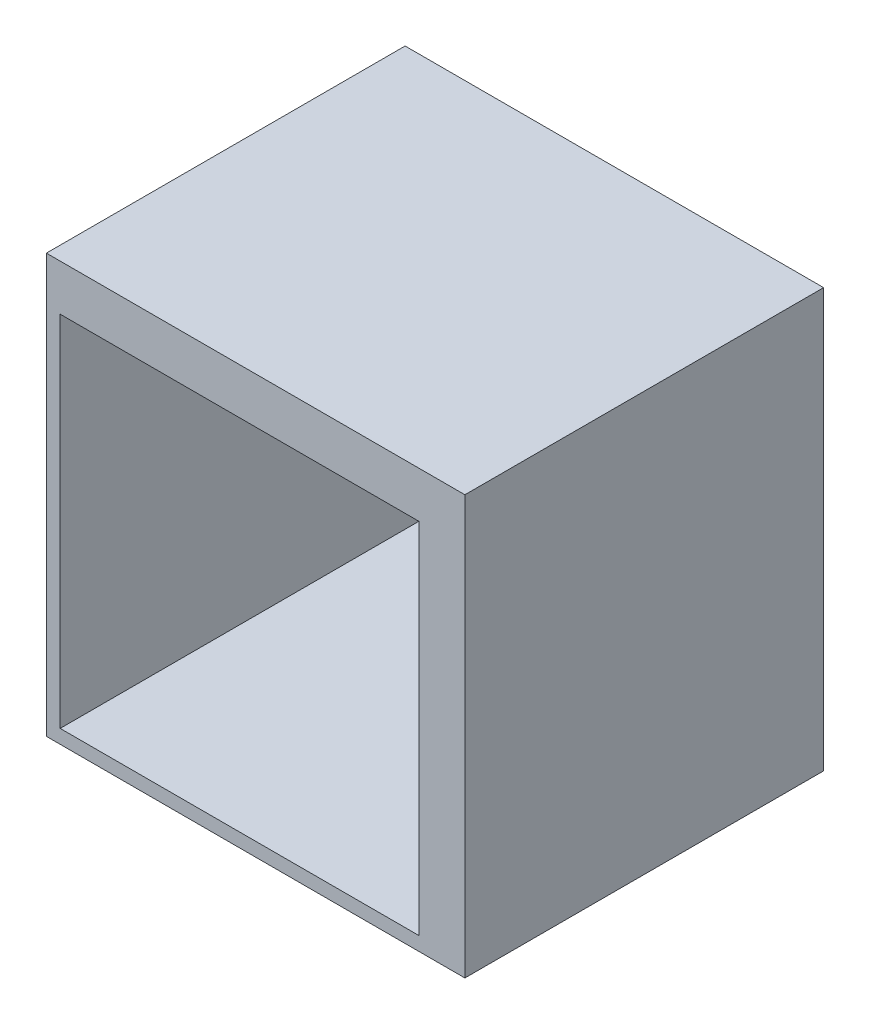
ISO-10303-21;
HEADER;
FILE_DESCRIPTION(('STEP AP214'),'2;1');
FILE_NAME('part.step','',(''),(''),'','','');
FILE_SCHEMA(('AUTOMOTIVE_DESIGN { 1 0 10303 214 1 1 1 1 }'));
ENDSEC;
DATA;
#1=APPLICATION_CONTEXT('core data for automotive mechanical design processes');
#2=APPLICATION_PROTOCOL_DEFINITION('international standard','automotive_design',2000,#1);
#3=PRODUCT_CONTEXT('',#1,'mechanical');
#4=PRODUCT('Part','Part','',(#3));
#5=PRODUCT_RELATED_PRODUCT_CATEGORY('part','',(#4));
#6=PRODUCT_DEFINITION_FORMATION('','',#4);
#7=PRODUCT_DEFINITION_CONTEXT('part definition',#1,'design');
#8=PRODUCT_DEFINITION('design','',#6,#7);
#9=PRODUCT_DEFINITION_SHAPE('','',#8);
#10=(LENGTH_UNIT() NAMED_UNIT(*) SI_UNIT(.MILLI.,.METRE.));
#11=(NAMED_UNIT(*) PLANE_ANGLE_UNIT() SI_UNIT($,.RADIAN.));
#12=(NAMED_UNIT(*) SI_UNIT($,.STERADIAN.) SOLID_ANGLE_UNIT());
#13=UNCERTAINTY_MEASURE_WITH_UNIT(LENGTH_MEASURE(1.E-05),#10,'distance_accuracy_value','');
#14=(GEOMETRIC_REPRESENTATION_CONTEXT(3) GLOBAL_UNCERTAINTY_ASSIGNED_CONTEXT((#13)) GLOBAL_UNIT_ASSIGNED_CONTEXT((#10,
#11,#12)) REPRESENTATION_CONTEXT('',''));
#15=CARTESIAN_POINT('',(0.,0.,0.));
#16=DIRECTION('',(0.,0.,1.));
#17=DIRECTION('',(1.,0.,0.));
#18=AXIS2_PLACEMENT_3D('',#15,#16,#17);
#19=CARTESIAN_POINT('',(0.,0.,390.));
#20=DIRECTION('',(0.,0.,1.));
#21=DIRECTION('',(1.,0.,0.));
#22=AXIS2_PLACEMENT_3D('',#19,#20,#21);
#23=PLANE('',#22);
#24=DIRECTION('',(0.,-1.,0.));
#25=VECTOR('',#24,1.);
#26=CARTESIAN_POINT('',(-109.370944432666,398.247624558718,390.));
#27=LINE('',#26,#25);
#28=CARTESIAN_POINT('',(-109.370944432666,398.247624558718,390.));
#29=VERTEX_POINT('',#28);
#30=CARTESIAN_POINT('',(-109.370944432666,-56.7523754412817,390.));
#31=VERTEX_POINT('',#30);
#32=EDGE_CURVE('E134',#29,#31,#27,.T.);
#33=ORIENTED_EDGE('',*,*,#32,.T.);
#34=DIRECTION('',(1.,0.,0.));
#35=VECTOR('',#34,1.);
#36=CARTESIAN_POINT('',(-109.370944432666,-56.7523754412817,390.));
#37=LINE('',#36,#35);
#38=CARTESIAN_POINT('',(345.629055567334,-56.7523754412817,390.));
#39=VERTEX_POINT('',#38);
#40=EDGE_CURVE('E137',#31,#39,#37,.T.);
#41=ORIENTED_EDGE('',*,*,#40,.T.);
#42=DIRECTION('',(0.,1.,0.));
#43=VECTOR('',#42,1.);
#44=CARTESIAN_POINT('',(345.629055567334,398.247624558718,390.));
#45=LINE('',#44,#43);
#46=CARTESIAN_POINT('',(345.629055567334,398.247624558718,390.));
#47=VERTEX_POINT('',#46);
#48=EDGE_CURVE('E140',#39,#47,#45,.T.);
#49=ORIENTED_EDGE('',*,*,#48,.T.);
#50=DIRECTION('',(-1.,0.,0.));
#51=VECTOR('',#50,1.);
#52=CARTESIAN_POINT('',(-109.370944432666,398.247624558718,390.));
#53=LINE('',#52,#51);
#54=EDGE_CURVE('E142',#47,#29,#53,.T.);
#55=ORIENTED_EDGE('',*,*,#54,.T.);
#56=EDGE_LOOP('',(#33,#41,#49,#55));
#57=FACE_BOUND('',#56,.T.);
#58=DIRECTION('',(1.,0.,0.));
#59=VECTOR('',#58,1.);
#60=CARTESIAN_POINT('',(-94.3709444326658,-41.7523754412817,390.));
#61=LINE('',#60,#59);
#62=CARTESIAN_POINT('',(-94.3709444326658,-41.7523754412817,390.));
#63=VERTEX_POINT('',#62);
#64=CARTESIAN_POINT('',(295.629055567334,-41.7523754412817,390.));
#65=VERTEX_POINT('',#64);
#66=EDGE_CURVE('E106',#63,#65,#61,.T.);
#67=ORIENTED_EDGE('',*,*,#66,.F.);
#68=DIRECTION('',(0.,-1.,0.));
#69=VECTOR('',#68,1.);
#70=CARTESIAN_POINT('',(-94.3709444326658,348.247624558718,390.));
#71=LINE('',#70,#69);
#72=CARTESIAN_POINT('',(-94.3709444326658,348.247624558718,390.));
#73=VERTEX_POINT('',#72);
#74=EDGE_CURVE('E98',#73,#63,#71,.T.);
#75=ORIENTED_EDGE('',*,*,#74,.F.);
#76=DIRECTION('',(-1.,0.,0.));
#77=VECTOR('',#76,1.);
#78=CARTESIAN_POINT('',(-94.3709444326658,348.247624558718,390.));
#79=LINE('',#78,#77);
#80=CARTESIAN_POINT('',(295.629055567334,348.247624558718,390.));
#81=VERTEX_POINT('',#80);
#82=EDGE_CURVE('E120',#81,#73,#79,.T.);
#83=ORIENTED_EDGE('',*,*,#82,.F.);
#84=DIRECTION('',(0.,1.,0.));
#85=VECTOR('',#84,1.);
#86=CARTESIAN_POINT('',(295.629055567334,348.247624558718,390.));
#87=LINE('',#86,#85);
#88=EDGE_CURVE('E118',#65,#81,#87,.T.);
#89=ORIENTED_EDGE('',*,*,#88,.F.);
#90=EDGE_LOOP('',(#67,#75,#83,#89));
#91=FACE_BOUND('',#90,.T.);
#92=ADVANCED_FACE('F33',(#57,#91),#23,.T.);
#93=CARTESIAN_POINT('',(0.,0.,0.));
#94=DIRECTION('',(0.,0.,1.));
#95=DIRECTION('',(1.,0.,0.));
#96=AXIS2_PLACEMENT_3D('',#93,#94,#95);
#97=PLANE('',#96);
#98=DIRECTION('',(0.,-1.,0.));
#99=VECTOR('',#98,1.);
#100=CARTESIAN_POINT('',(-109.370944432666,398.247624558718,0.));
#101=LINE('',#100,#99);
#102=CARTESIAN_POINT('',(-109.370944432666,398.247624558718,0.));
#103=VERTEX_POINT('',#102);
#104=CARTESIAN_POINT('',(-109.370944432666,-56.7523754412817,0.));
#105=VERTEX_POINT('',#104);
#106=EDGE_CURVE('E114',#103,#105,#101,.T.);
#107=ORIENTED_EDGE('',*,*,#106,.F.);
#108=DIRECTION('',(-1.,0.,0.));
#109=VECTOR('',#108,1.);
#110=CARTESIAN_POINT('',(-109.370944432666,398.247624558718,0.));
#111=LINE('',#110,#109);
#112=CARTESIAN_POINT('',(345.629055567334,398.247624558718,0.));
#113=VERTEX_POINT('',#112);
#114=EDGE_CURVE('E138',#113,#103,#111,.T.);
#115=ORIENTED_EDGE('',*,*,#114,.F.);
#116=DIRECTION('',(0.,1.,0.));
#117=VECTOR('',#116,1.);
#118=CARTESIAN_POINT('',(345.629055567334,398.247624558718,0.));
#119=LINE('',#118,#117);
#120=CARTESIAN_POINT('',(345.629055567334,-56.7523754412817,0.));
#121=VERTEX_POINT('',#120);
#122=EDGE_CURVE('E149',#121,#113,#119,.T.);
#123=ORIENTED_EDGE('',*,*,#122,.F.);
#124=DIRECTION('',(1.,0.,0.));
#125=VECTOR('',#124,1.);
#126=CARTESIAN_POINT('',(-109.370944432666,-56.7523754412817,0.));
#127=LINE('',#126,#125);
#128=EDGE_CURVE('E147',#105,#121,#127,.T.);
#129=ORIENTED_EDGE('',*,*,#128,.F.);
#130=EDGE_LOOP('',(#107,#115,#123,#129));
#131=FACE_BOUND('',#130,.T.);
#132=DIRECTION('',(0.,-1.,0.));
#133=VECTOR('',#132,1.);
#134=CARTESIAN_POINT('',(-94.3709444326658,348.247624558718,0.));
#135=LINE('',#134,#133);
#136=CARTESIAN_POINT('',(-94.3709444326658,348.247624558718,0.));
#137=VERTEX_POINT('',#136);
#138=CARTESIAN_POINT('',(-94.3709444326658,-41.7523754412817,0.));
#139=VERTEX_POINT('',#138);
#140=EDGE_CURVE('E56',#137,#139,#135,.T.);
#141=ORIENTED_EDGE('',*,*,#140,.T.);
#142=DIRECTION('',(1.,0.,0.));
#143=VECTOR('',#142,1.);
#144=CARTESIAN_POINT('',(-94.3709444326658,-41.7523754412817,0.));
#145=LINE('',#144,#143);
#146=CARTESIAN_POINT('',(295.629055567334,-41.7523754412817,0.));
#147=VERTEX_POINT('',#146);
#148=EDGE_CURVE('E113',#139,#147,#145,.T.);
#149=ORIENTED_EDGE('',*,*,#148,.T.);
#150=DIRECTION('',(0.,1.,0.));
#151=VECTOR('',#150,1.);
#152=CARTESIAN_POINT('',(295.629055567334,348.247624558718,0.));
#153=LINE('',#152,#151);
#154=CARTESIAN_POINT('',(295.629055567334,348.247624558718,0.));
#155=VERTEX_POINT('',#154);
#156=EDGE_CURVE('E126',#147,#155,#153,.T.);
#157=ORIENTED_EDGE('',*,*,#156,.T.);
#158=DIRECTION('',(-1.,0.,0.));
#159=VECTOR('',#158,1.);
#160=CARTESIAN_POINT('',(-94.3709444326658,348.247624558718,0.));
#161=LINE('',#160,#159);
#162=EDGE_CURVE('E107',#155,#137,#161,.T.);
#163=ORIENTED_EDGE('',*,*,#162,.T.);
#164=EDGE_LOOP('',(#141,#149,#157,#163));
#165=FACE_BOUND('',#164,.T.);
#166=ADVANCED_FACE('F167',(#131,#165),#97,.F.);
#167=CARTESIAN_POINT('',(-109.370944432666,398.247624558718,390.));
#168=DIRECTION('',(1.,0.,0.));
#169=DIRECTION('',(0.,1.,0.));
#170=AXIS2_PLACEMENT_3D('',#167,#168,#169);
#171=PLANE('',#170);
#172=ORIENTED_EDGE('',*,*,#106,.T.);
#173=DIRECTION('',(0.,0.,-1.));
#174=VECTOR('',#173,1.);
#175=CARTESIAN_POINT('',(-109.370944432666,-56.7523754412817,390.));
#176=LINE('',#175,#174);
#177=EDGE_CURVE('E11',#31,#105,#176,.T.);
#178=ORIENTED_EDGE('',*,*,#177,.F.);
#179=ORIENTED_EDGE('',*,*,#32,.F.);
#180=DIRECTION('',(0.,0.,-1.));
#181=VECTOR('',#180,1.);
#182=CARTESIAN_POINT('',(-109.370944432666,398.247624558718,390.));
#183=LINE('',#182,#181);
#184=EDGE_CURVE('E144',#29,#103,#183,.T.);
#185=ORIENTED_EDGE('',*,*,#184,.T.);
#186=EDGE_LOOP('',(#172,#178,#179,#185));
#187=FACE_BOUND('',#186,.T.);
#188=ADVANCED_FACE('F35',(#187),#171,.F.);
#189=CARTESIAN_POINT('',(-109.370944432666,-56.7523754412817,390.));
#190=DIRECTION('',(0.,1.,0.));
#191=DIRECTION('',(0.,0.,1.));
#192=AXIS2_PLACEMENT_3D('',#189,#190,#191);
#193=PLANE('',#192);
#194=ORIENTED_EDGE('',*,*,#128,.T.);
#195=DIRECTION('',(0.,0.,-1.));
#196=VECTOR('',#195,1.);
#197=CARTESIAN_POINT('',(345.629055567334,-56.7523754412817,390.));
#198=LINE('',#197,#196);
#199=EDGE_CURVE('E41',#39,#121,#198,.T.);
#200=ORIENTED_EDGE('',*,*,#199,.F.);
#201=ORIENTED_EDGE('',*,*,#40,.F.);
#202=ORIENTED_EDGE('',*,*,#177,.T.);
#203=EDGE_LOOP('',(#194,#200,#201,#202));
#204=FACE_BOUND('',#203,.T.);
#205=ADVANCED_FACE('F177',(#204),#193,.F.);
#206=CARTESIAN_POINT('',(345.629055567334,398.247624558718,390.));
#207=DIRECTION('',(-1.,0.,0.));
#208=DIRECTION('',(0.,-1.,0.));
#209=AXIS2_PLACEMENT_3D('',#206,#207,#208);
#210=PLANE('',#209);
#211=ORIENTED_EDGE('',*,*,#122,.T.);
#212=DIRECTION('',(0.,0.,-1.));
#213=VECTOR('',#212,1.);
#214=CARTESIAN_POINT('',(345.629055567334,398.247624558718,390.));
#215=LINE('',#214,#213);
#216=EDGE_CURVE('E154',#47,#113,#215,.T.);
#217=ORIENTED_EDGE('',*,*,#216,.F.);
#218=ORIENTED_EDGE('',*,*,#48,.F.);
#219=ORIENTED_EDGE('',*,*,#199,.T.);
#220=EDGE_LOOP('',(#211,#217,#218,#219));
#221=FACE_BOUND('',#220,.T.);
#222=ADVANCED_FACE('F161',(#221),#210,.F.);
#223=CARTESIAN_POINT('',(-109.370944432666,398.247624558718,390.));
#224=DIRECTION('',(0.,-1.,0.));
#225=DIRECTION('',(0.,0.,-1.));
#226=AXIS2_PLACEMENT_3D('',#223,#224,#225);
#227=PLANE('',#226);
#228=ORIENTED_EDGE('',*,*,#114,.T.);
#229=ORIENTED_EDGE('',*,*,#184,.F.);
#230=ORIENTED_EDGE('',*,*,#54,.F.);
#231=ORIENTED_EDGE('',*,*,#216,.T.);
#232=EDGE_LOOP('',(#228,#229,#230,#231));
#233=FACE_BOUND('',#232,.T.);
#234=ADVANCED_FACE('F171',(#233),#227,.F.);
#235=CARTESIAN_POINT('',(-94.3709444326658,348.247624558718,390.));
#236=DIRECTION('',(1.,0.,0.));
#237=DIRECTION('',(0.,1.,0.));
#238=AXIS2_PLACEMENT_3D('',#235,#236,#237);
#239=PLANE('',#238);
#240=ORIENTED_EDGE('',*,*,#140,.F.);
#241=DIRECTION('',(0.,0.,-1.));
#242=VECTOR('',#241,1.);
#243=CARTESIAN_POINT('',(-94.3709444326658,348.247624558718,390.));
#244=LINE('',#243,#242);
#245=EDGE_CURVE('E102',#73,#137,#244,.T.);
#246=ORIENTED_EDGE('',*,*,#245,.F.);
#247=ORIENTED_EDGE('',*,*,#74,.T.);
#248=DIRECTION('',(0.,0.,-1.));
#249=VECTOR('',#248,1.);
#250=CARTESIAN_POINT('',(-94.3709444326658,-41.7523754412817,390.));
#251=LINE('',#250,#249);
#252=EDGE_CURVE('E101',#63,#139,#251,.T.);
#253=ORIENTED_EDGE('',*,*,#252,.T.);
#254=EDGE_LOOP('',(#240,#246,#247,#253));
#255=FACE_BOUND('',#254,.T.);
#256=ADVANCED_FACE('F100',(#255),#239,.T.);
#257=CARTESIAN_POINT('',(-94.3709444326658,-41.7523754412817,390.));
#258=DIRECTION('',(0.,1.,0.));
#259=DIRECTION('',(0.,0.,1.));
#260=AXIS2_PLACEMENT_3D('',#257,#258,#259);
#261=PLANE('',#260);
#262=ORIENTED_EDGE('',*,*,#148,.F.);
#263=ORIENTED_EDGE('',*,*,#252,.F.);
#264=ORIENTED_EDGE('',*,*,#66,.T.);
#265=DIRECTION('',(0.,0.,-1.));
#266=VECTOR('',#265,1.);
#267=CARTESIAN_POINT('',(295.629055567334,-41.7523754412817,390.));
#268=LINE('',#267,#266);
#269=EDGE_CURVE('E115',#65,#147,#268,.T.);
#270=ORIENTED_EDGE('',*,*,#269,.T.);
#271=EDGE_LOOP('',(#262,#263,#264,#270));
#272=FACE_BOUND('',#271,.T.);
#273=ADVANCED_FACE('F110',(#272),#261,.T.);
#274=CARTESIAN_POINT('',(295.629055567334,348.247624558718,390.));
#275=DIRECTION('',(-1.,0.,0.));
#276=DIRECTION('',(0.,0.,1.));
#277=AXIS2_PLACEMENT_3D('',#274,#275,#276);
#278=PLANE('',#277);
#279=ORIENTED_EDGE('',*,*,#156,.F.);
#280=ORIENTED_EDGE('',*,*,#269,.F.);
#281=ORIENTED_EDGE('',*,*,#88,.T.);
#282=DIRECTION('',(0.,0.,-1.));
#283=VECTOR('',#282,1.);
#284=CARTESIAN_POINT('',(295.629055567334,348.247624558718,390.));
#285=LINE('',#284,#283);
#286=EDGE_CURVE('E48',#81,#155,#285,.T.);
#287=ORIENTED_EDGE('',*,*,#286,.T.);
#288=EDGE_LOOP('',(#279,#280,#281,#287));
#289=FACE_BOUND('',#288,.T.);
#290=ADVANCED_FACE('F200',(#289),#278,.T.);
#291=CARTESIAN_POINT('',(-94.3709444326658,348.247624558718,390.));
#292=DIRECTION('',(0.,-1.,0.));
#293=DIRECTION('',(0.,0.,-1.));
#294=AXIS2_PLACEMENT_3D('',#291,#292,#293);
#295=PLANE('',#294);
#296=ORIENTED_EDGE('',*,*,#162,.F.);
#297=ORIENTED_EDGE('',*,*,#286,.F.);
#298=ORIENTED_EDGE('',*,*,#82,.T.);
#299=ORIENTED_EDGE('',*,*,#245,.T.);
#300=EDGE_LOOP('',(#296,#297,#298,#299));
#301=FACE_BOUND('',#300,.T.);
#302=ADVANCED_FACE('F204',(#301),#295,.T.);
#303=CLOSED_SHELL('',(#92,#166,#188,#205,#222,#234,#256,#273,#290,#302));
#304=MANIFOLD_SOLID_BREP('B2',#303);
#305=ADVANCED_BREP_SHAPE_REPRESENTATION('',(#18,#304),#14);
#306=SHAPE_DEFINITION_REPRESENTATION(#9,#305);
ENDSEC;
END-ISO-10303-21;
